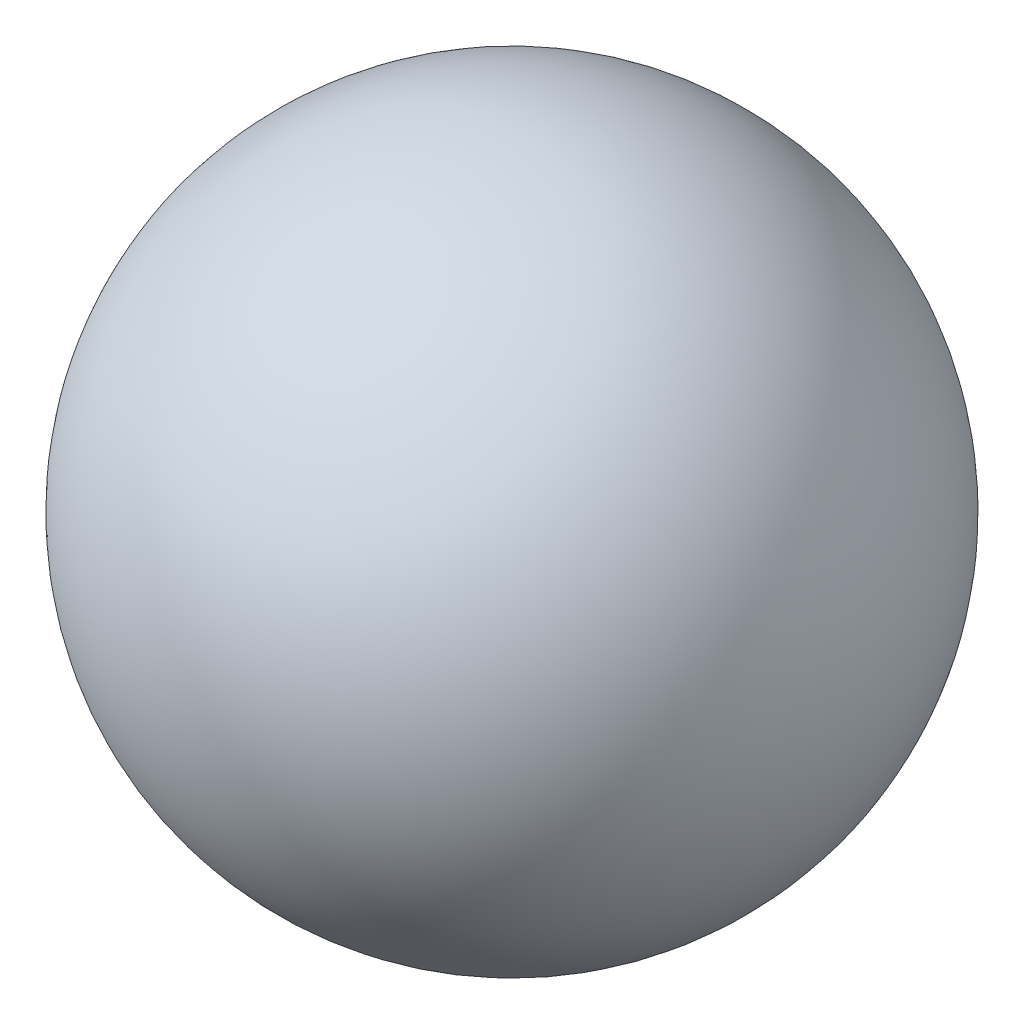
ISO-10303-21;
HEADER;
FILE_DESCRIPTION(('STEP AP214'),'2;1');
FILE_NAME('part.step','',(''),(''),'','','');
FILE_SCHEMA(('AUTOMOTIVE_DESIGN { 1 0 10303 214 1 1 1 1 }'));
ENDSEC;
DATA;
#1=APPLICATION_CONTEXT('core data for automotive mechanical design processes');
#2=APPLICATION_PROTOCOL_DEFINITION('international standard','automotive_design',2000,#1);
#3=PRODUCT_CONTEXT('',#1,'mechanical');
#4=PRODUCT('Part','Part','',(#3));
#5=PRODUCT_RELATED_PRODUCT_CATEGORY('part','',(#4));
#6=PRODUCT_DEFINITION_FORMATION('','',#4);
#7=PRODUCT_DEFINITION_CONTEXT('part definition',#1,'design');
#8=PRODUCT_DEFINITION('design','',#6,#7);
#9=PRODUCT_DEFINITION_SHAPE('','',#8);
#10=(LENGTH_UNIT() NAMED_UNIT(*) SI_UNIT(.MILLI.,.METRE.));
#11=(NAMED_UNIT(*) PLANE_ANGLE_UNIT() SI_UNIT($,.RADIAN.));
#12=(NAMED_UNIT(*) SI_UNIT($,.STERADIAN.) SOLID_ANGLE_UNIT());
#13=UNCERTAINTY_MEASURE_WITH_UNIT(LENGTH_MEASURE(1.E-05),#10,'distance_accuracy_value','');
#14=(GEOMETRIC_REPRESENTATION_CONTEXT(3) GLOBAL_UNCERTAINTY_ASSIGNED_CONTEXT((#13)) GLOBAL_UNIT_ASSIGNED_CONTEXT((#10,
#11,#12)) REPRESENTATION_CONTEXT('',''));
#15=CARTESIAN_POINT('',(0.,0.,0.));
#16=DIRECTION('',(0.,0.,1.));
#17=DIRECTION('',(1.,0.,0.));
#18=AXIS2_PLACEMENT_3D('',#15,#16,#17);
#19=CARTESIAN_POINT('',(0.641302767411419,0.,0.));
#20=DIRECTION('',(-1.,0.,0.));
#21=DIRECTION('',(0.,1.,0.));
#22=AXIS2_PLACEMENT_3D('',#19,#20,#21);
#23=SPHERICAL_SURFACE('',#22,12.);
#24=CARTESIAN_POINT('',(-11.3586972325886,0.,0.));
#25=VERTEX_POINT('',#24);
#26=VERTEX_LOOP('',#25);
#27=FACE_BOUND('',#26,.T.);
#28=ADVANCED_FACE('F33',(#27),#23,.T.);
#29=CLOSED_SHELL('',(#28));
#30=MANIFOLD_SOLID_BREP('B2',#29);
#31=ADVANCED_BREP_SHAPE_REPRESENTATION('',(#18,#30),#14);
#32=SHAPE_DEFINITION_REPRESENTATION(#9,#31);
ENDSEC;
END-ISO-10303-21;
